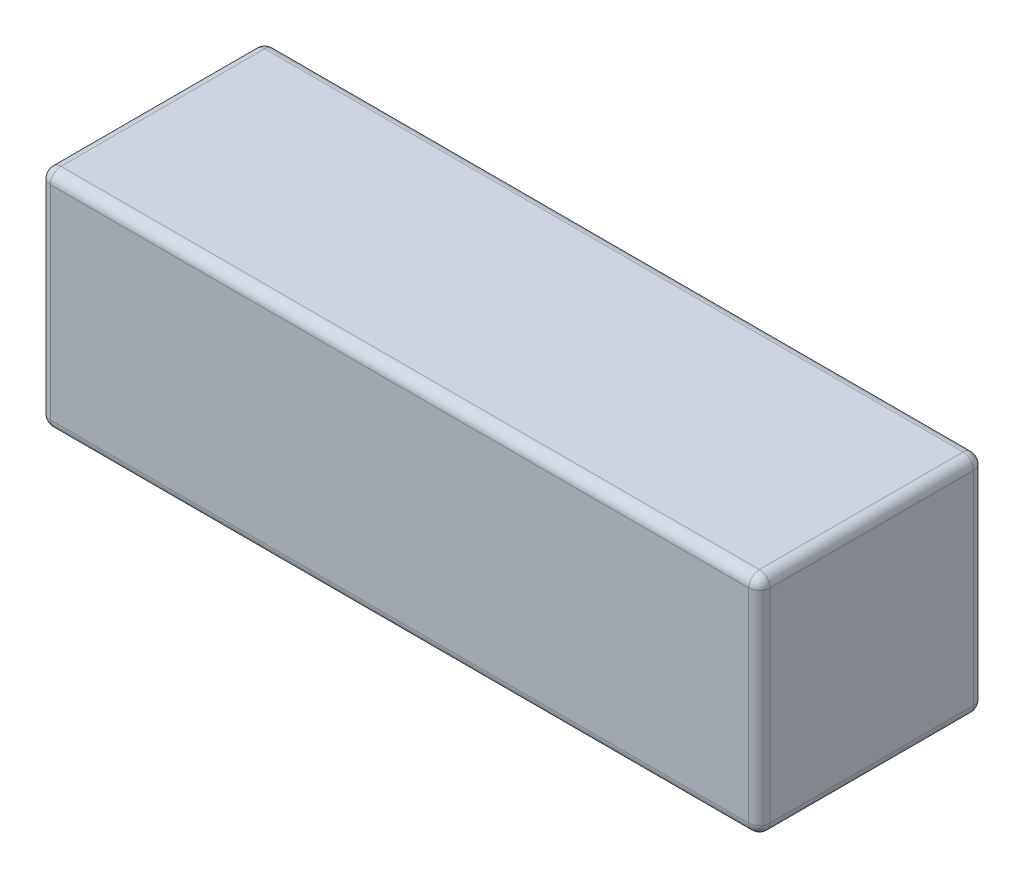
ISO-10303-21;
HEADER;
FILE_DESCRIPTION(('STEP AP214'),'2;1');
FILE_NAME('part.step','',(''),(''),'','','');
FILE_SCHEMA(('AUTOMOTIVE_DESIGN { 1 0 10303 214 1 1 1 1 }'));
ENDSEC;
DATA;
#1=APPLICATION_CONTEXT('core data for automotive mechanical design processes');
#2=APPLICATION_PROTOCOL_DEFINITION('international standard','automotive_design',2000,#1);
#3=PRODUCT_CONTEXT('',#1,'mechanical');
#4=PRODUCT('Part','Part','',(#3));
#5=PRODUCT_RELATED_PRODUCT_CATEGORY('part','',(#4));
#6=PRODUCT_DEFINITION_FORMATION('','',#4);
#7=PRODUCT_DEFINITION_CONTEXT('part definition',#1,'design');
#8=PRODUCT_DEFINITION('design','',#6,#7);
#9=PRODUCT_DEFINITION_SHAPE('','',#8);
#10=(LENGTH_UNIT() NAMED_UNIT(*) SI_UNIT(.MILLI.,.METRE.));
#11=(NAMED_UNIT(*) PLANE_ANGLE_UNIT() SI_UNIT($,.RADIAN.));
#12=(NAMED_UNIT(*) SI_UNIT($,.STERADIAN.) SOLID_ANGLE_UNIT());
#13=UNCERTAINTY_MEASURE_WITH_UNIT(LENGTH_MEASURE(1.E-05),#10,'distance_accuracy_value','');
#14=(GEOMETRIC_REPRESENTATION_CONTEXT(3) GLOBAL_UNCERTAINTY_ASSIGNED_CONTEXT((#13)) GLOBAL_UNIT_ASSIGNED_CONTEXT((#10,
#11,#12)) REPRESENTATION_CONTEXT('',''));
#15=CARTESIAN_POINT('',(0.,0.,0.));
#16=DIRECTION('',(0.,0.,1.));
#17=DIRECTION('',(1.,0.,0.));
#18=AXIS2_PLACEMENT_3D('',#15,#16,#17);
#19=CARTESIAN_POINT('',(13.85,-0.15,-3.2542396313364));
#20=DIRECTION('',(1.,0.,0.));
#21=DIRECTION('',(0.,1.,0.));
#22=AXIS2_PLACEMENT_3D('',#19,#20,#21);
#23=SPHERICAL_SURFACE('',#22,0.15);
#24=CARTESIAN_POINT('',(13.85,-0.15,-3.2542396313364));
#25=DIRECTION('',(0.,-1.,0.));
#26=DIRECTION('',(0.,0.,-1.));
#27=AXIS2_PLACEMENT_3D('',#24,#25,#26);
#28=CIRCLE('',#27,0.15);
#29=CARTESIAN_POINT('',(13.85,-0.15,-3.4042396313364));
#30=VERTEX_POINT('',#29);
#31=CARTESIAN_POINT('',(14.,-0.15,-3.2542396313364));
#32=VERTEX_POINT('',#31);
#33=EDGE_CURVE('E103',#30,#32,#28,.T.);
#34=ORIENTED_EDGE('',*,*,#33,.F.);
#35=CARTESIAN_POINT('',(13.85,-0.15,-3.2542396313364));
#36=DIRECTION('',(1.,0.,0.));
#37=DIRECTION('',(0.,0.,-1.));
#38=AXIS2_PLACEMENT_3D('',#35,#36,#37);
#39=CIRCLE('',#38,0.15);
#40=CARTESIAN_POINT('',(13.85,0.,-3.2542396313364));
#41=VERTEX_POINT('',#40);
#42=EDGE_CURVE('E277',#41,#30,#39,.F.);
#43=ORIENTED_EDGE('',*,*,#42,.F.);
#44=CARTESIAN_POINT('',(13.85,-0.15,-3.2542396313364));
#45=DIRECTION('',(0.,0.,1.));
#46=DIRECTION('',(1.,0.,0.));
#47=AXIS2_PLACEMENT_3D('',#44,#45,#46);
#48=CIRCLE('',#47,0.15);
#49=EDGE_CURVE('E279',#32,#41,#48,.T.);
#50=ORIENTED_EDGE('',*,*,#49,.F.);
#51=EDGE_LOOP('',(#34,#43,#50));
#52=FACE_BOUND('',#51,.T.);
#53=ADVANCED_FACE('F17',(#52),#23,.T.);
#54=CARTESIAN_POINT('',(3.99,-0.15,-3.2542396313364));
#55=DIRECTION('',(1.,0.,0.));
#56=DIRECTION('',(0.,1.,0.));
#57=AXIS2_PLACEMENT_3D('',#54,#55,#56);
#58=SPHERICAL_SURFACE('',#57,0.15);
#59=CARTESIAN_POINT('',(3.99,-0.15,-3.2542396313364));
#60=DIRECTION('',(0.,0.,-1.));
#61=DIRECTION('',(-1.,0.,0.));
#62=AXIS2_PLACEMENT_3D('',#59,#60,#61);
#63=CIRCLE('',#62,0.15);
#64=CARTESIAN_POINT('',(3.99,0.,-3.2542396313364));
#65=VERTEX_POINT('',#64);
#66=CARTESIAN_POINT('',(3.84,-0.15,-3.2542396313364));
#67=VERTEX_POINT('',#66);
#68=EDGE_CURVE('E270',#65,#67,#63,.F.);
#69=ORIENTED_EDGE('',*,*,#68,.F.);
#70=CARTESIAN_POINT('',(3.99,-0.15,-3.2542396313364));
#71=DIRECTION('',(1.,0.,0.));
#72=DIRECTION('',(0.,0.,-1.));
#73=AXIS2_PLACEMENT_3D('',#70,#71,#72);
#74=CIRCLE('',#73,0.15);
#75=CARTESIAN_POINT('',(3.99,-0.15,-3.4042396313364));
#76=VERTEX_POINT('',#75);
#77=EDGE_CURVE('E273',#76,#65,#74,.T.);
#78=ORIENTED_EDGE('',*,*,#77,.F.);
#79=CARTESIAN_POINT('',(3.99,-0.15,-3.2542396313364));
#80=DIRECTION('',(0.,-1.,0.));
#81=DIRECTION('',(0.,0.,-1.));
#82=AXIS2_PLACEMENT_3D('',#79,#80,#81);
#83=CIRCLE('',#82,0.15);
#84=EDGE_CURVE('E264',#67,#76,#83,.T.);
#85=ORIENTED_EDGE('',*,*,#84,.F.);
#86=EDGE_LOOP('',(#69,#78,#85));
#87=FACE_BOUND('',#86,.T.);
#88=ADVANCED_FACE('F160',(#87),#58,.T.);
#89=CARTESIAN_POINT('',(13.85,-3.025,-3.2542396313364));
#90=DIRECTION('',(1.,0.,0.));
#91=DIRECTION('',(0.,1.,0.));
#92=AXIS2_PLACEMENT_3D('',#89,#90,#91);
#93=SPHERICAL_SURFACE('',#92,0.15);
#94=CARTESIAN_POINT('',(13.85,-3.025,-3.2542396313364));
#95=DIRECTION('',(-1.,0.,0.));
#96=DIRECTION('',(0.,0.,1.));
#97=AXIS2_PLACEMENT_3D('',#94,#95,#96);
#98=CIRCLE('',#97,0.15);
#99=CARTESIAN_POINT('',(13.85,-3.025,-3.4042396313364));
#100=VERTEX_POINT('',#99);
#101=CARTESIAN_POINT('',(13.85,-3.175,-3.25423963133487));
#102=VERTEX_POINT('',#101);
#103=EDGE_CURVE('E128',#100,#102,#98,.T.);
#104=ORIENTED_EDGE('',*,*,#103,.F.);
#105=CARTESIAN_POINT('',(13.85,-3.025,-3.2542396313364));
#106=DIRECTION('',(0.,-1.,0.));
#107=DIRECTION('',(0.,0.,-1.));
#108=AXIS2_PLACEMENT_3D('',#105,#106,#107);
#109=CIRCLE('',#108,0.15);
#110=CARTESIAN_POINT('',(14.,-3.025,-3.2542396313364));
#111=VERTEX_POINT('',#110);
#112=EDGE_CURVE('E120',#111,#100,#109,.F.);
#113=ORIENTED_EDGE('',*,*,#112,.F.);
#114=CARTESIAN_POINT('',(13.85,-3.025,-3.2542396313364));
#115=DIRECTION('',(0.,0.,-1.));
#116=DIRECTION('',(-1.,0.,0.));
#117=AXIS2_PLACEMENT_3D('',#114,#115,#116);
#118=CIRCLE('',#117,0.15);
#119=EDGE_CURVE('E136',#102,#111,#118,.F.);
#120=ORIENTED_EDGE('',*,*,#119,.F.);
#121=EDGE_LOOP('',(#104,#113,#120));
#122=FACE_BOUND('',#121,.T.);
#123=ADVANCED_FACE('F134',(#122),#93,.T.);
#124=CARTESIAN_POINT('',(14.,-3.175,-3.4042396313364));
#125=DIRECTION('',(0.,0.,-1.));
#126=DIRECTION('',(-1.,0.,0.));
#127=AXIS2_PLACEMENT_3D('',#124,#125,#126);
#128=PLANE('',#127);
#129=DIRECTION('',(0.,-1.,0.));
#130=VECTOR('',#129,1.);
#131=CARTESIAN_POINT('',(13.85,-3.175,-3.4042396313364));
#132=LINE('',#131,#130);
#133=EDGE_CURVE('E110',#100,#30,#132,.F.);
#134=ORIENTED_EDGE('',*,*,#133,.F.);
#135=DIRECTION('',(-1.,0.,0.));
#136=VECTOR('',#135,1.);
#137=CARTESIAN_POINT('',(14.,-3.025,-3.4042396313364));
#138=LINE('',#137,#136);
#139=CARTESIAN_POINT('',(3.99,-3.02499999999923,-3.4042396313364));
#140=VERTEX_POINT('',#139);
#141=EDGE_CURVE('E114',#140,#100,#138,.F.);
#142=ORIENTED_EDGE('',*,*,#141,.F.);
#143=DIRECTION('',(0.,-1.,0.));
#144=VECTOR('',#143,1.);
#145=CARTESIAN_POINT('',(3.99,-3.175,-3.4042396313364));
#146=LINE('',#145,#144);
#147=EDGE_CURVE('E262',#76,#140,#146,.T.);
#148=ORIENTED_EDGE('',*,*,#147,.F.);
#149=DIRECTION('',(1.,0.,0.));
#150=VECTOR('',#149,1.);
#151=CARTESIAN_POINT('',(3.84,-0.15,-3.4042396313364));
#152=LINE('',#151,#150);
#153=EDGE_CURVE('E117',#30,#76,#152,.F.);
#154=ORIENTED_EDGE('',*,*,#153,.F.);
#155=EDGE_LOOP('',(#134,#142,#148,#154));
#156=FACE_BOUND('',#155,.T.);
#157=ADVANCED_FACE('F112',(#156),#128,.T.);
#158=CARTESIAN_POINT('',(3.99,-3.025,-3.2542396313364));
#159=DIRECTION('',(1.,0.,0.));
#160=DIRECTION('',(0.,1.,0.));
#161=AXIS2_PLACEMENT_3D('',#158,#159,#160);
#162=SPHERICAL_SURFACE('',#161,0.15);
#163=CARTESIAN_POINT('',(3.99,-3.025,-3.2542396313364));
#164=DIRECTION('',(0.,0.,1.));
#165=DIRECTION('',(1.,0.,0.));
#166=AXIS2_PLACEMENT_3D('',#163,#164,#165);
#167=CIRCLE('',#166,0.15);
#168=CARTESIAN_POINT('',(3.84,-3.025,-3.2542396313364));
#169=VERTEX_POINT('',#168);
#170=CARTESIAN_POINT('',(3.99,-3.175,-3.2542396313364));
#171=VERTEX_POINT('',#170);
#172=EDGE_CURVE('E131',#169,#171,#167,.T.);
#173=ORIENTED_EDGE('',*,*,#172,.F.);
#174=CARTESIAN_POINT('',(3.99,-3.025,-3.2542396313364));
#175=DIRECTION('',(0.,-1.,0.));
#176=DIRECTION('',(0.,0.,-1.));
#177=AXIS2_PLACEMENT_3D('',#174,#175,#176);
#178=CIRCLE('',#177,0.15);
#179=EDGE_CURVE('E267',#140,#169,#178,.F.);
#180=ORIENTED_EDGE('',*,*,#179,.F.);
#181=CARTESIAN_POINT('',(3.99,-3.025,-3.2542396313364));
#182=DIRECTION('',(-1.,0.,0.));
#183=DIRECTION('',(0.,0.,1.));
#184=AXIS2_PLACEMENT_3D('',#181,#182,#183);
#185=CIRCLE('',#184,0.15);
#186=EDGE_CURVE('E130',#171,#140,#185,.F.);
#187=ORIENTED_EDGE('',*,*,#186,.F.);
#188=EDGE_LOOP('',(#173,#180,#187));
#189=FACE_BOUND('',#188,.T.);
#190=ADVANCED_FACE('F151',(#189),#162,.T.);
#191=CARTESIAN_POINT('',(13.85,-3.175,-3.2542396313364));
#192=DIRECTION('',(0.,-1.,0.));
#193=DIRECTION('',(0.,0.,-1.));
#194=AXIS2_PLACEMENT_3D('',#191,#192,#193);
#195=CYLINDRICAL_SURFACE('',#194,0.15);
#196=ORIENTED_EDGE('',*,*,#33,.T.);
#197=DIRECTION('',(0.,1.,0.));
#198=VECTOR('',#197,1.);
#199=CARTESIAN_POINT('',(14.,-3.175,-3.2542396313364));
#200=LINE('',#199,#198);
#201=EDGE_CURVE('E142',#111,#32,#200,.T.);
#202=ORIENTED_EDGE('',*,*,#201,.F.);
#203=ORIENTED_EDGE('',*,*,#112,.T.);
#204=ORIENTED_EDGE('',*,*,#133,.T.);
#205=EDGE_LOOP('',(#196,#202,#203,#204));
#206=FACE_BOUND('',#205,.T.);
#207=ADVANCED_FACE('F140',(#206),#195,.T.);
#208=CARTESIAN_POINT('',(13.85,-0.15,-0.229239631336402));
#209=DIRECTION('',(0.,0.,1.));
#210=DIRECTION('',(1.,0.,0.));
#211=AXIS2_PLACEMENT_3D('',#208,#209,#210);
#212=CYLINDRICAL_SURFACE('',#211,0.15);
#213=ORIENTED_EDGE('',*,*,#49,.T.);
#214=DIRECTION('',(0.,0.,1.));
#215=VECTOR('',#214,1.);
#216=CARTESIAN_POINT('',(13.85,0.,-0.229239631336402));
#217=LINE('',#216,#215);
#218=CARTESIAN_POINT('',(13.85,0.,-0.379239631336402));
#219=VERTEX_POINT('',#218);
#220=EDGE_CURVE('E247',#219,#41,#217,.F.);
#221=ORIENTED_EDGE('',*,*,#220,.F.);
#222=CARTESIAN_POINT('',(13.85,-0.15,-0.379239631336402));
#223=DIRECTION('',(0.,0.,1.));
#224=DIRECTION('',(1.,0.,0.));
#225=AXIS2_PLACEMENT_3D('',#222,#223,#224);
#226=CIRCLE('',#225,0.15);
#227=CARTESIAN_POINT('',(14.,-0.15,-0.379239631336402));
#228=VERTEX_POINT('',#227);
#229=EDGE_CURVE('E249',#228,#219,#226,.T.);
#230=ORIENTED_EDGE('',*,*,#229,.F.);
#231=DIRECTION('',(0.,0.,-1.));
#232=VECTOR('',#231,1.);
#233=CARTESIAN_POINT('',(14.,-0.15,-0.229239631336402));
#234=LINE('',#233,#232);
#235=EDGE_CURVE('E252',#32,#228,#234,.F.);
#236=ORIENTED_EDGE('',*,*,#235,.F.);
#237=EDGE_LOOP('',(#213,#221,#230,#236));
#238=FACE_BOUND('',#237,.T.);
#239=ADVANCED_FACE('F283',(#238),#212,.T.);
#240=CARTESIAN_POINT('',(3.84,-0.15,-3.2542396313364));
#241=DIRECTION('',(1.,0.,0.));
#242=DIRECTION('',(0.,0.,-1.));
#243=AXIS2_PLACEMENT_3D('',#240,#241,#242);
#244=CYLINDRICAL_SURFACE('',#243,0.15);
#245=ORIENTED_EDGE('',*,*,#77,.T.);
#246=DIRECTION('',(1.,0.,0.));
#247=VECTOR('',#246,1.);
#248=CARTESIAN_POINT('',(3.84,0.,-3.2542396313364));
#249=LINE('',#248,#247);
#250=EDGE_CURVE('E348',#41,#65,#249,.F.);
#251=ORIENTED_EDGE('',*,*,#250,.F.);
#252=ORIENTED_EDGE('',*,*,#42,.T.);
#253=ORIENTED_EDGE('',*,*,#153,.T.);
#254=EDGE_LOOP('',(#245,#251,#252,#253));
#255=FACE_BOUND('',#254,.T.);
#256=ADVANCED_FACE('F345',(#255),#244,.T.);
#257=CARTESIAN_POINT('',(3.99,-0.15,-0.229239631336402));
#258=DIRECTION('',(0.,0.,-1.));
#259=DIRECTION('',(-1.,0.,0.));
#260=AXIS2_PLACEMENT_3D('',#257,#258,#259);
#261=CYLINDRICAL_SURFACE('',#260,0.15);
#262=ORIENTED_EDGE('',*,*,#68,.T.);
#263=DIRECTION('',(0.,0.,1.));
#264=VECTOR('',#263,1.);
#265=CARTESIAN_POINT('',(3.84,-0.15,-3.4042396313364));
#266=LINE('',#265,#264);
#267=CARTESIAN_POINT('',(3.84,-0.15,-0.379239631336402));
#268=VERTEX_POINT('',#267);
#269=EDGE_CURVE('E220',#268,#67,#266,.F.);
#270=ORIENTED_EDGE('',*,*,#269,.F.);
#271=CARTESIAN_POINT('',(3.99,-0.15,-0.379239631336402));
#272=DIRECTION('',(0.,0.,1.));
#273=DIRECTION('',(1.,0.,0.));
#274=AXIS2_PLACEMENT_3D('',#271,#272,#273);
#275=CIRCLE('',#274,0.15);
#276=CARTESIAN_POINT('',(3.99,0.,-0.379239631336402));
#277=VERTEX_POINT('',#276);
#278=EDGE_CURVE('E223',#277,#268,#275,.T.);
#279=ORIENTED_EDGE('',*,*,#278,.F.);
#280=DIRECTION('',(0.,0.,1.));
#281=VECTOR('',#280,1.);
#282=CARTESIAN_POINT('',(3.99,0.,-0.229239631336402));
#283=LINE('',#282,#281);
#284=EDGE_CURVE('E351',#65,#277,#283,.T.);
#285=ORIENTED_EDGE('',*,*,#284,.F.);
#286=EDGE_LOOP('',(#262,#270,#279,#285));
#287=FACE_BOUND('',#286,.T.);
#288=ADVANCED_FACE('F361',(#287),#261,.T.);
#289=CARTESIAN_POINT('',(3.99,-3.175,-3.2542396313364));
#290=DIRECTION('',(0.,-1.,0.));
#291=DIRECTION('',(0.,0.,-1.));
#292=AXIS2_PLACEMENT_3D('',#289,#290,#291);
#293=CYLINDRICAL_SURFACE('',#292,0.15);
#294=ORIENTED_EDGE('',*,*,#84,.T.);
#295=ORIENTED_EDGE('',*,*,#147,.T.);
#296=ORIENTED_EDGE('',*,*,#179,.T.);
#297=DIRECTION('',(0.,1.,0.));
#298=VECTOR('',#297,1.);
#299=CARTESIAN_POINT('',(3.84,-3.175,-3.2542396313364));
#300=LINE('',#299,#298);
#301=EDGE_CURVE('E217',#67,#169,#300,.F.);
#302=ORIENTED_EDGE('',*,*,#301,.F.);
#303=EDGE_LOOP('',(#294,#295,#296,#302));
#304=FACE_BOUND('',#303,.T.);
#305=ADVANCED_FACE('F343',(#304),#293,.T.);
#306=CARTESIAN_POINT('',(13.85,-3.025,-0.229239631336402));
#307=DIRECTION('',(0.,0.,-1.));
#308=DIRECTION('',(-1.,0.,0.));
#309=AXIS2_PLACEMENT_3D('',#306,#307,#308);
#310=CYLINDRICAL_SURFACE('',#309,0.15);
#311=ORIENTED_EDGE('',*,*,#119,.T.);
#312=DIRECTION('',(0.,0.,-1.));
#313=VECTOR('',#312,1.);
#314=CARTESIAN_POINT('',(14.,-3.025,-0.229239631336402));
#315=LINE('',#314,#313);
#316=CARTESIAN_POINT('',(14.,-3.025,-0.379239631336402));
#317=VERTEX_POINT('',#316);
#318=EDGE_CURVE('E256',#317,#111,#315,.T.);
#319=ORIENTED_EDGE('',*,*,#318,.F.);
#320=CARTESIAN_POINT('',(13.85,-3.025,-0.379239631336402));
#321=DIRECTION('',(0.,0.,-1.));
#322=DIRECTION('',(1.,0.,0.));
#323=AXIS2_PLACEMENT_3D('',#320,#321,#322);
#324=CIRCLE('',#323,0.15);
#325=CARTESIAN_POINT('',(13.85,-3.175,-0.379239631336402));
#326=VERTEX_POINT('',#325);
#327=EDGE_CURVE('E209',#326,#317,#324,.F.);
#328=ORIENTED_EDGE('',*,*,#327,.F.);
#329=DIRECTION('',(0.,0.,1.));
#330=VECTOR('',#329,1.);
#331=CARTESIAN_POINT('',(13.85,-3.175,-0.229239631336402));
#332=LINE('',#331,#330);
#333=EDGE_CURVE('E206',#326,#102,#332,.F.);
#334=ORIENTED_EDGE('',*,*,#333,.T.);
#335=EDGE_LOOP('',(#311,#319,#328,#334));
#336=FACE_BOUND('',#335,.T.);
#337=ADVANCED_FACE('F292',(#336),#310,.T.);
#338=CARTESIAN_POINT('',(14.,-3.025,-3.2542396313364));
#339=DIRECTION('',(-1.,0.,0.));
#340=DIRECTION('',(0.,0.,1.));
#341=AXIS2_PLACEMENT_3D('',#338,#339,#340);
#342=CYLINDRICAL_SURFACE('',#341,0.15);
#343=ORIENTED_EDGE('',*,*,#186,.T.);
#344=ORIENTED_EDGE('',*,*,#141,.T.);
#345=ORIENTED_EDGE('',*,*,#103,.T.);
#346=DIRECTION('',(1.,0.,0.));
#347=VECTOR('',#346,1.);
#348=CARTESIAN_POINT('',(3.84,-3.175,-3.2542396313364));
#349=LINE('',#348,#347);
#350=EDGE_CURVE('E307',#102,#171,#349,.F.);
#351=ORIENTED_EDGE('',*,*,#350,.T.);
#352=EDGE_LOOP('',(#343,#344,#345,#351));
#353=FACE_BOUND('',#352,.T.);
#354=ADVANCED_FACE('F126',(#353),#342,.T.);
#355=CARTESIAN_POINT('',(3.99,-3.025,-3.4042396313364));
#356=DIRECTION('',(0.,0.,1.));
#357=DIRECTION('',(1.,0.,0.));
#358=AXIS2_PLACEMENT_3D('',#355,#356,#357);
#359=CYLINDRICAL_SURFACE('',#358,0.15);
#360=ORIENTED_EDGE('',*,*,#172,.T.);
#361=DIRECTION('',(0.,0.,1.));
#362=VECTOR('',#361,1.);
#363=CARTESIAN_POINT('',(3.99,-3.175,-0.229239631336402));
#364=LINE('',#363,#362);
#365=CARTESIAN_POINT('',(3.99,-3.175,-0.379239631336306));
#366=VERTEX_POINT('',#365);
#367=EDGE_CURVE('E337',#171,#366,#364,.T.);
#368=ORIENTED_EDGE('',*,*,#367,.T.);
#369=CARTESIAN_POINT('',(3.99,-3.025,-0.379239631336402));
#370=DIRECTION('',(0.,-2.55541177815717E-12,-1.));
#371=DIRECTION('',(1.,0.,0.));
#372=AXIS2_PLACEMENT_3D('',#369,#370,#371);
#373=CIRCLE('',#372,0.15);
#374=CARTESIAN_POINT('',(3.84,-3.025,-0.379239631336402));
#375=VERTEX_POINT('',#374);
#376=EDGE_CURVE('E208',#375,#366,#373,.F.);
#377=ORIENTED_EDGE('',*,*,#376,.F.);
#378=DIRECTION('',(0.,0.,1.));
#379=VECTOR('',#378,1.);
#380=CARTESIAN_POINT('',(3.84,-3.025,-3.4042396313364));
#381=LINE('',#380,#379);
#382=EDGE_CURVE('E214',#169,#375,#381,.T.);
#383=ORIENTED_EDGE('',*,*,#382,.F.);
#384=EDGE_LOOP('',(#360,#368,#377,#383));
#385=FACE_BOUND('',#384,.T.);
#386=ADVANCED_FACE('F340',(#385),#359,.T.);
#387=CARTESIAN_POINT('',(14.,-3.175,-0.229239631336402));
#388=DIRECTION('',(1.,0.,0.));
#389=DIRECTION('',(0.,0.,-1.));
#390=AXIS2_PLACEMENT_3D('',#387,#388,#389);
#391=PLANE('',#390);
#392=ORIENTED_EDGE('',*,*,#235,.T.);
#393=DIRECTION('',(0.,-1.,0.));
#394=VECTOR('',#393,1.);
#395=CARTESIAN_POINT('',(14.,-3.175,-0.379239631336402));
#396=LINE('',#395,#394);
#397=EDGE_CURVE('E289',#317,#228,#396,.F.);
#398=ORIENTED_EDGE('',*,*,#397,.F.);
#399=ORIENTED_EDGE('',*,*,#318,.T.);
#400=ORIENTED_EDGE('',*,*,#201,.T.);
#401=EDGE_LOOP('',(#392,#398,#399,#400));
#402=FACE_BOUND('',#401,.T.);
#403=ADVANCED_FACE('F241',(#402),#391,.T.);
#404=CARTESIAN_POINT('',(13.85,-0.15,-0.379239631336402));
#405=DIRECTION('',(1.,0.,0.));
#406=DIRECTION('',(0.,1.,0.));
#407=AXIS2_PLACEMENT_3D('',#404,#405,#406);
#408=SPHERICAL_SURFACE('',#407,0.15);
#409=CARTESIAN_POINT('',(13.85,-0.15,-0.379239631336402));
#410=DIRECTION('',(0.,-1.,0.));
#411=DIRECTION('',(0.,0.,-1.));
#412=AXIS2_PLACEMENT_3D('',#409,#410,#411);
#413=CIRCLE('',#412,0.15);
#414=CARTESIAN_POINT('',(13.85,-0.15,-0.229239631336402));
#415=VERTEX_POINT('',#414);
#416=EDGE_CURVE('E332',#228,#415,#413,.T.);
#417=ORIENTED_EDGE('',*,*,#416,.F.);
#418=ORIENTED_EDGE('',*,*,#229,.T.);
#419=CARTESIAN_POINT('',(13.85,-0.15,-0.379239631336402));
#420=DIRECTION('',(-1.,0.,0.));
#421=DIRECTION('',(0.,0.,1.));
#422=AXIS2_PLACEMENT_3D('',#419,#420,#421);
#423=CIRCLE('',#422,0.15);
#424=EDGE_CURVE('E326',#415,#219,#423,.T.);
#425=ORIENTED_EDGE('',*,*,#424,.F.);
#426=EDGE_LOOP('',(#417,#418,#425));
#427=FACE_BOUND('',#426,.T.);
#428=ADVANCED_FACE('F236',(#427),#408,.T.);
#429=CARTESIAN_POINT('',(3.84,0.,-0.229239631336402));
#430=DIRECTION('',(0.,1.,0.));
#431=DIRECTION('',(0.,0.,1.));
#432=AXIS2_PLACEMENT_3D('',#429,#430,#431);
#433=PLANE('',#432);
#434=ORIENTED_EDGE('',*,*,#284,.T.);
#435=DIRECTION('',(-1.,0.,0.));
#436=VECTOR('',#435,1.);
#437=CARTESIAN_POINT('',(3.84,0.,-0.379239631336402));
#438=LINE('',#437,#436);
#439=EDGE_CURVE('E323',#219,#277,#438,.T.);
#440=ORIENTED_EDGE('',*,*,#439,.F.);
#441=ORIENTED_EDGE('',*,*,#220,.T.);
#442=ORIENTED_EDGE('',*,*,#250,.T.);
#443=EDGE_LOOP('',(#434,#440,#441,#442));
#444=FACE_BOUND('',#443,.T.);
#445=ADVANCED_FACE('F232',(#444),#433,.T.);
#446=CARTESIAN_POINT('',(3.99,-0.15,-0.379239631336402));
#447=DIRECTION('',(1.,0.,0.));
#448=DIRECTION('',(0.,1.,0.));
#449=AXIS2_PLACEMENT_3D('',#446,#447,#448);
#450=SPHERICAL_SURFACE('',#449,0.15);
#451=CARTESIAN_POINT('',(3.99,-0.15,-0.379239631336402));
#452=DIRECTION('',(-1.,0.,0.));
#453=DIRECTION('',(0.,0.,1.));
#454=AXIS2_PLACEMENT_3D('',#451,#452,#453);
#455=CIRCLE('',#454,0.15);
#456=CARTESIAN_POINT('',(3.99,-0.15,-0.229239631336402));
#457=VERTEX_POINT('',#456);
#458=EDGE_CURVE('E329',#277,#457,#455,.F.);
#459=ORIENTED_EDGE('',*,*,#458,.F.);
#460=ORIENTED_EDGE('',*,*,#278,.T.);
#461=CARTESIAN_POINT('',(3.99,-0.15,-0.379239631336402));
#462=DIRECTION('',(0.,-1.,0.));
#463=DIRECTION('',(0.,0.,-1.));
#464=AXIS2_PLACEMENT_3D('',#461,#462,#463);
#465=CIRCLE('',#464,0.15);
#466=EDGE_CURVE('E318',#457,#268,#465,.T.);
#467=ORIENTED_EDGE('',*,*,#466,.F.);
#468=EDGE_LOOP('',(#459,#460,#467));
#469=FACE_BOUND('',#468,.T.);
#470=ADVANCED_FACE('F228',(#469),#450,.T.);
#471=CARTESIAN_POINT('',(3.84,-3.175,-3.4042396313364));
#472=DIRECTION('',(-1.,0.,0.));
#473=DIRECTION('',(0.,0.,1.));
#474=AXIS2_PLACEMENT_3D('',#471,#472,#473);
#475=PLANE('',#474);
#476=ORIENTED_EDGE('',*,*,#382,.T.);
#477=DIRECTION('',(0.,-1.,0.));
#478=VECTOR('',#477,1.);
#479=CARTESIAN_POINT('',(3.84,-3.175,-0.379239631336402));
#480=LINE('',#479,#478);
#481=EDGE_CURVE('E302',#268,#375,#480,.T.);
#482=ORIENTED_EDGE('',*,*,#481,.F.);
#483=ORIENTED_EDGE('',*,*,#269,.T.);
#484=ORIENTED_EDGE('',*,*,#301,.T.);
#485=EDGE_LOOP('',(#476,#482,#483,#484));
#486=FACE_BOUND('',#485,.T.);
#487=ADVANCED_FACE('F231',(#486),#475,.T.);
#488=CARTESIAN_POINT('',(13.85,-3.025,-0.379239631336402));
#489=DIRECTION('',(1.,0.,0.));
#490=DIRECTION('',(0.,1.,0.));
#491=AXIS2_PLACEMENT_3D('',#488,#489,#490);
#492=SPHERICAL_SURFACE('',#491,0.15);
#493=CARTESIAN_POINT('',(13.85,-3.025,-0.379239631336402));
#494=DIRECTION('',(1.,0.,0.));
#495=DIRECTION('',(0.,0.,-1.));
#496=AXIS2_PLACEMENT_3D('',#493,#494,#495);
#497=CIRCLE('',#496,0.15);
#498=CARTESIAN_POINT('',(13.85,-3.025,-0.229239631336402));
#499=VERTEX_POINT('',#498);
#500=EDGE_CURVE('E298',#326,#499,#497,.F.);
#501=ORIENTED_EDGE('',*,*,#500,.F.);
#502=ORIENTED_EDGE('',*,*,#327,.T.);
#503=CARTESIAN_POINT('',(13.85,-3.025,-0.379239631336402));
#504=DIRECTION('',(0.,-1.,0.));
#505=DIRECTION('',(0.,0.,-1.));
#506=AXIS2_PLACEMENT_3D('',#503,#504,#505);
#507=CIRCLE('',#506,0.15);
#508=EDGE_CURVE('E295',#499,#317,#507,.F.);
#509=ORIENTED_EDGE('',*,*,#508,.F.);
#510=EDGE_LOOP('',(#501,#502,#509));
#511=FACE_BOUND('',#510,.T.);
#512=ADVANCED_FACE('F200',(#511),#492,.T.);
#513=CARTESIAN_POINT('',(3.99,-3.025,-0.379239631336402));
#514=DIRECTION('',(1.,0.,0.));
#515=DIRECTION('',(0.,1.,0.));
#516=AXIS2_PLACEMENT_3D('',#513,#514,#515);
#517=SPHERICAL_SURFACE('',#516,0.15);
#518=CARTESIAN_POINT('',(3.99,-3.025,-0.379239631336402));
#519=DIRECTION('',(1.,0.,0.));
#520=DIRECTION('',(0.,0.,-1.));
#521=AXIS2_PLACEMENT_3D('',#518,#519,#520);
#522=CIRCLE('',#521,0.15);
#523=CARTESIAN_POINT('',(3.99,-3.025,-0.229239631336402));
#524=VERTEX_POINT('',#523);
#525=EDGE_CURVE('E35',#524,#366,#522,.T.);
#526=ORIENTED_EDGE('',*,*,#525,.F.);
#527=CARTESIAN_POINT('',(3.99,-3.025,-0.379239631336402));
#528=DIRECTION('',(0.,-1.,0.));
#529=DIRECTION('',(0.,0.,-1.));
#530=AXIS2_PLACEMENT_3D('',#527,#528,#529);
#531=CIRCLE('',#530,0.15);
#532=EDGE_CURVE('E321',#375,#524,#531,.F.);
#533=ORIENTED_EDGE('',*,*,#532,.F.);
#534=ORIENTED_EDGE('',*,*,#376,.T.);
#535=EDGE_LOOP('',(#526,#533,#534));
#536=FACE_BOUND('',#535,.T.);
#537=ADVANCED_FACE('F195',(#536),#517,.T.);
#538=CARTESIAN_POINT('',(3.84,-3.175,-0.229239631336402));
#539=DIRECTION('',(0.,1.,0.));
#540=DIRECTION('',(0.,0.,1.));
#541=AXIS2_PLACEMENT_3D('',#538,#539,#540);
#542=PLANE('',#541);
#543=ORIENTED_EDGE('',*,*,#350,.F.);
#544=ORIENTED_EDGE('',*,*,#333,.F.);
#545=DIRECTION('',(1.,0.,0.));
#546=VECTOR('',#545,1.);
#547=CARTESIAN_POINT('',(3.84,-3.175,-0.379239631336402));
#548=LINE('',#547,#546);
#549=EDGE_CURVE('E306',#366,#326,#548,.T.);
#550=ORIENTED_EDGE('',*,*,#549,.F.);
#551=ORIENTED_EDGE('',*,*,#367,.F.);
#552=EDGE_LOOP('',(#543,#544,#550,#551));
#553=FACE_BOUND('',#552,.T.);
#554=ADVANCED_FACE('F191',(#553),#542,.F.);
#555=CARTESIAN_POINT('',(13.85,-3.175,-0.379239631336402));
#556=DIRECTION('',(0.,-1.,0.));
#557=DIRECTION('',(0.,0.,-1.));
#558=AXIS2_PLACEMENT_3D('',#555,#556,#557);
#559=CYLINDRICAL_SURFACE('',#558,0.15);
#560=ORIENTED_EDGE('',*,*,#416,.T.);
#561=DIRECTION('',(0.,1.,0.));
#562=VECTOR('',#561,1.);
#563=CARTESIAN_POINT('',(13.85,-3.175,-0.229239631336402));
#564=LINE('',#563,#562);
#565=EDGE_CURVE('E308',#499,#415,#564,.T.);
#566=ORIENTED_EDGE('',*,*,#565,.F.);
#567=ORIENTED_EDGE('',*,*,#508,.T.);
#568=ORIENTED_EDGE('',*,*,#397,.T.);
#569=EDGE_LOOP('',(#560,#566,#567,#568));
#570=FACE_BOUND('',#569,.T.);
#571=ADVANCED_FACE('F187',(#570),#559,.T.);
#572=CARTESIAN_POINT('',(3.84,-0.15,-0.379239631336402));
#573=DIRECTION('',(-1.,0.,0.));
#574=DIRECTION('',(0.,0.,1.));
#575=AXIS2_PLACEMENT_3D('',#572,#573,#574);
#576=CYLINDRICAL_SURFACE('',#575,0.15);
#577=ORIENTED_EDGE('',*,*,#424,.T.);
#578=ORIENTED_EDGE('',*,*,#439,.T.);
#579=ORIENTED_EDGE('',*,*,#458,.T.);
#580=DIRECTION('',(1.,0.,0.));
#581=VECTOR('',#580,1.);
#582=CARTESIAN_POINT('',(3.84,-0.15,-0.229239631336402));
#583=LINE('',#582,#581);
#584=EDGE_CURVE('E311',#415,#457,#583,.F.);
#585=ORIENTED_EDGE('',*,*,#584,.F.);
#586=EDGE_LOOP('',(#577,#578,#579,#585));
#587=FACE_BOUND('',#586,.T.);
#588=ADVANCED_FACE('F183',(#587),#576,.T.);
#589=CARTESIAN_POINT('',(3.99,-3.175,-0.379239631336402));
#590=DIRECTION('',(0.,-1.,0.));
#591=DIRECTION('',(0.,0.,-1.));
#592=AXIS2_PLACEMENT_3D('',#589,#590,#591);
#593=CYLINDRICAL_SURFACE('',#592,0.15);
#594=ORIENTED_EDGE('',*,*,#466,.T.);
#595=ORIENTED_EDGE('',*,*,#481,.T.);
#596=ORIENTED_EDGE('',*,*,#532,.T.);
#597=DIRECTION('',(0.,1.,0.));
#598=VECTOR('',#597,1.);
#599=CARTESIAN_POINT('',(3.99,-3.175,-0.229239631336402));
#600=LINE('',#599,#598);
#601=EDGE_CURVE('E26',#457,#524,#600,.F.);
#602=ORIENTED_EDGE('',*,*,#601,.F.);
#603=EDGE_LOOP('',(#594,#595,#596,#602));
#604=FACE_BOUND('',#603,.T.);
#605=ADVANCED_FACE('F176',(#604),#593,.T.);
#606=CARTESIAN_POINT('',(3.84,-3.025,-0.379239631336402));
#607=DIRECTION('',(1.,0.,0.));
#608=DIRECTION('',(0.,0.,-1.));
#609=AXIS2_PLACEMENT_3D('',#606,#607,#608);
#610=CYLINDRICAL_SURFACE('',#609,0.15);
#611=ORIENTED_EDGE('',*,*,#525,.T.);
#612=ORIENTED_EDGE('',*,*,#549,.T.);
#613=ORIENTED_EDGE('',*,*,#500,.T.);
#614=DIRECTION('',(1.,0.,0.));
#615=VECTOR('',#614,1.);
#616=CARTESIAN_POINT('',(3.84,-3.025,-0.229239631336402));
#617=LINE('',#616,#615);
#618=EDGE_CURVE('E11',#524,#499,#617,.T.);
#619=ORIENTED_EDGE('',*,*,#618,.F.);
#620=EDGE_LOOP('',(#611,#612,#613,#619));
#621=FACE_BOUND('',#620,.T.);
#622=ADVANCED_FACE('F170',(#621),#610,.T.);
#623=CARTESIAN_POINT('',(3.84,-3.175,-0.229239631336402));
#624=DIRECTION('',(0.,0.,1.));
#625=DIRECTION('',(1.,0.,0.));
#626=AXIS2_PLACEMENT_3D('',#623,#624,#625);
#627=PLANE('',#626);
#628=ORIENTED_EDGE('',*,*,#601,.T.);
#629=ORIENTED_EDGE('',*,*,#618,.T.);
#630=ORIENTED_EDGE('',*,*,#565,.T.);
#631=ORIENTED_EDGE('',*,*,#584,.T.);
#632=EDGE_LOOP('',(#628,#629,#630,#631));
#633=FACE_BOUND('',#632,.T.);
#634=ADVANCED_FACE('F168',(#633),#627,.T.);
#635=CLOSED_SHELL('',(#53,#88,#123,#157,#190,#207,#239,#256,#288,#305,#337,#354,#386,#403,#428,
#445,#470,#487,#512,#537,#554,#571,#588,#605,#622,#634));
#636=MANIFOLD_SOLID_BREP('B1',#635);
#637=ADVANCED_BREP_SHAPE_REPRESENTATION('',(#18,#636),#14);
#638=SHAPE_DEFINITION_REPRESENTATION(#9,#637);
ENDSEC;
END-ISO-10303-21;
